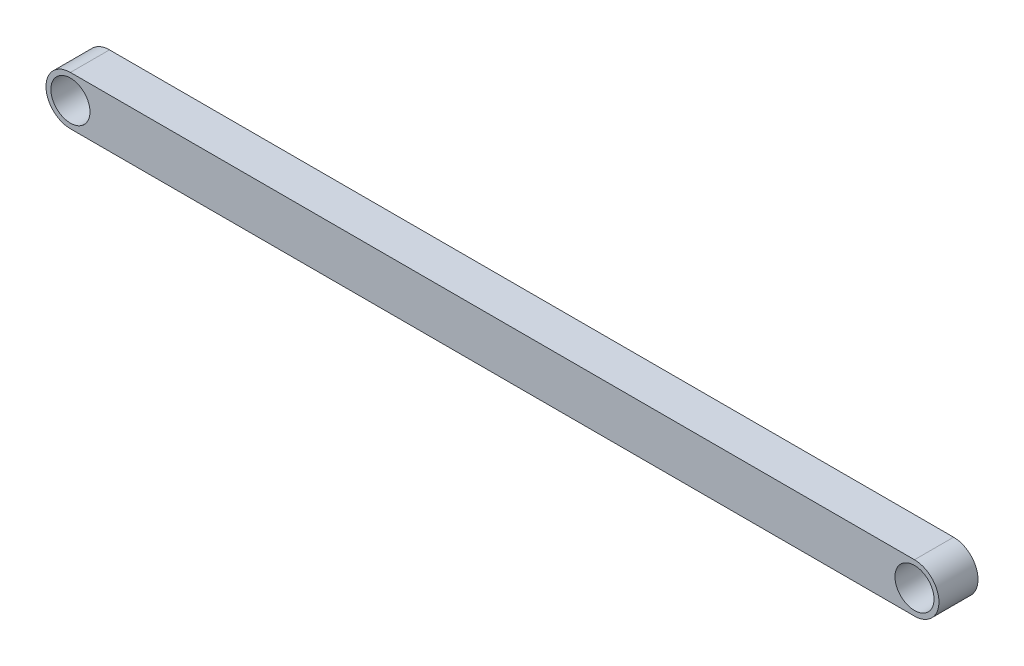
ISO-10303-21;
HEADER;
FILE_DESCRIPTION(('STEP AP214'),'2;1');
FILE_NAME('part.step','',(''),(''),'','','');
FILE_SCHEMA(('AUTOMOTIVE_DESIGN { 1 0 10303 214 1 1 1 1 }'));
ENDSEC;
DATA;
#1=APPLICATION_CONTEXT('core data for automotive mechanical design processes');
#2=APPLICATION_PROTOCOL_DEFINITION('international standard','automotive_design',2000,#1);
#3=PRODUCT_CONTEXT('',#1,'mechanical');
#4=PRODUCT('Part','Part','',(#3));
#5=PRODUCT_RELATED_PRODUCT_CATEGORY('part','',(#4));
#6=PRODUCT_DEFINITION_FORMATION('','',#4);
#7=PRODUCT_DEFINITION_CONTEXT('part definition',#1,'design');
#8=PRODUCT_DEFINITION('design','',#6,#7);
#9=PRODUCT_DEFINITION_SHAPE('','',#8);
#10=(LENGTH_UNIT() NAMED_UNIT(*) SI_UNIT(.MILLI.,.METRE.));
#11=(NAMED_UNIT(*) PLANE_ANGLE_UNIT() SI_UNIT($,.RADIAN.));
#12=(NAMED_UNIT(*) SI_UNIT($,.STERADIAN.) SOLID_ANGLE_UNIT());
#13=UNCERTAINTY_MEASURE_WITH_UNIT(LENGTH_MEASURE(1.E-05),#10,'distance_accuracy_value','');
#14=(GEOMETRIC_REPRESENTATION_CONTEXT(3) GLOBAL_UNCERTAINTY_ASSIGNED_CONTEXT((#13)) GLOBAL_UNIT_ASSIGNED_CONTEXT((#10,
#11,#12)) REPRESENTATION_CONTEXT('',''));
#15=CARTESIAN_POINT('',(0.,0.,0.));
#16=DIRECTION('',(0.,0.,1.));
#17=DIRECTION('',(1.,0.,0.));
#18=AXIS2_PLACEMENT_3D('',#15,#16,#17);
#19=CARTESIAN_POINT('',(0.,0.,2.));
#20=DIRECTION('',(0.,0.,1.));
#21=DIRECTION('',(1.,0.,0.));
#22=AXIS2_PLACEMENT_3D('',#19,#20,#21);
#23=PLANE('',#22);
#24=CARTESIAN_POINT('',(0.,0.,2.));
#25=DIRECTION('',(0.,0.,1.));
#26=DIRECTION('',(1.,0.,0.));
#27=AXIS2_PLACEMENT_3D('',#24,#25,#26);
#28=CIRCLE('',#27,1.);
#29=CARTESIAN_POINT('',(1.,0.,2.));
#30=VERTEX_POINT('',#29);
#31=EDGE_CURVE('E100',#30,#30,#28,.T.);
#32=ORIENTED_EDGE('',*,*,#31,.F.);
#33=EDGE_LOOP('',(#32));
#34=FACE_BOUND('',#33,.T.);
#35=CARTESIAN_POINT('',(0.,0.,2.));
#36=DIRECTION('',(0.,0.,1.));
#37=DIRECTION('',(1.,0.,0.));
#38=AXIS2_PLACEMENT_3D('',#35,#36,#37);
#39=CIRCLE('',#38,1.25);
#40=CARTESIAN_POINT('',(0.,1.25,2.));
#41=VERTEX_POINT('',#40);
#42=CARTESIAN_POINT('',(0.,-1.25,2.));
#43=VERTEX_POINT('',#42);
#44=EDGE_CURVE('E85',#41,#43,#39,.T.);
#45=ORIENTED_EDGE('',*,*,#44,.T.);
#46=DIRECTION('',(1.,0.,0.));
#47=VECTOR('',#46,1.);
#48=CARTESIAN_POINT('',(0.,-1.25,2.));
#49=LINE('',#48,#47);
#50=CARTESIAN_POINT('',(43.2,-1.25,2.));
#51=VERTEX_POINT('',#50);
#52=EDGE_CURVE('E80',#43,#51,#49,.T.);
#53=ORIENTED_EDGE('',*,*,#52,.T.);
#54=CARTESIAN_POINT('',(43.2,0.,2.));
#55=DIRECTION('',(0.,0.,1.));
#56=DIRECTION('',(1.,0.,0.));
#57=AXIS2_PLACEMENT_3D('',#54,#55,#56);
#58=CIRCLE('',#57,1.25);
#59=CARTESIAN_POINT('',(43.2,1.25,2.));
#60=VERTEX_POINT('',#59);
#61=EDGE_CURVE('E83',#51,#60,#58,.T.);
#62=ORIENTED_EDGE('',*,*,#61,.T.);
#63=DIRECTION('',(-1.,0.,0.));
#64=VECTOR('',#63,1.);
#65=CARTESIAN_POINT('',(0.,1.25,2.));
#66=LINE('',#65,#64);
#67=EDGE_CURVE('E50',#60,#41,#66,.T.);
#68=ORIENTED_EDGE('',*,*,#67,.T.);
#69=EDGE_LOOP('',(#45,#53,#62,#68));
#70=FACE_BOUND('',#69,.T.);
#71=CARTESIAN_POINT('',(43.2,0.,2.));
#72=DIRECTION('',(0.,0.,1.));
#73=DIRECTION('',(1.,0.,0.));
#74=AXIS2_PLACEMENT_3D('',#71,#72,#73);
#75=CIRCLE('',#74,0.999999999999998);
#76=CARTESIAN_POINT('',(44.2,0.,2.));
#77=VERTEX_POINT('',#76);
#78=EDGE_CURVE('E115',#77,#77,#75,.T.);
#79=ORIENTED_EDGE('',*,*,#78,.F.);
#80=EDGE_LOOP('',(#79));
#81=FACE_BOUND('',#80,.T.);
#82=ADVANCED_FACE('F33',(#34,#70,#81),#23,.T.);
#83=CARTESIAN_POINT('',(0.,0.,0.));
#84=DIRECTION('',(0.,0.,1.));
#85=DIRECTION('',(1.,0.,0.));
#86=AXIS2_PLACEMENT_3D('',#83,#84,#85);
#87=PLANE('',#86);
#88=CARTESIAN_POINT('',(0.,0.,0.));
#89=DIRECTION('',(0.,0.,1.));
#90=DIRECTION('',(1.,0.,0.));
#91=AXIS2_PLACEMENT_3D('',#88,#89,#90);
#92=CIRCLE('',#91,1.25);
#93=CARTESIAN_POINT('',(0.,1.25,0.));
#94=VERTEX_POINT('',#93);
#95=CARTESIAN_POINT('',(0.,-1.25,0.));
#96=VERTEX_POINT('',#95);
#97=EDGE_CURVE('E97',#94,#96,#92,.T.);
#98=ORIENTED_EDGE('',*,*,#97,.F.);
#99=DIRECTION('',(-1.,0.,0.));
#100=VECTOR('',#99,1.);
#101=CARTESIAN_POINT('',(0.,1.25,0.));
#102=LINE('',#101,#100);
#103=CARTESIAN_POINT('',(43.2,1.25,0.));
#104=VERTEX_POINT('',#103);
#105=EDGE_CURVE('E73',#104,#94,#102,.T.);
#106=ORIENTED_EDGE('',*,*,#105,.F.);
#107=CARTESIAN_POINT('',(43.2,0.,0.));
#108=DIRECTION('',(0.,0.,1.));
#109=DIRECTION('',(1.,0.,0.));
#110=AXIS2_PLACEMENT_3D('',#107,#108,#109);
#111=CIRCLE('',#110,1.25);
#112=CARTESIAN_POINT('',(43.2,-1.25,0.));
#113=VERTEX_POINT('',#112);
#114=EDGE_CURVE('E67',#113,#104,#111,.T.);
#115=ORIENTED_EDGE('',*,*,#114,.F.);
#116=DIRECTION('',(1.,0.,0.));
#117=VECTOR('',#116,1.);
#118=CARTESIAN_POINT('',(0.,-1.25,0.));
#119=LINE('',#118,#117);
#120=EDGE_CURVE('E89',#96,#113,#119,.T.);
#121=ORIENTED_EDGE('',*,*,#120,.F.);
#122=EDGE_LOOP('',(#98,#106,#115,#121));
#123=FACE_BOUND('',#122,.T.);
#124=CARTESIAN_POINT('',(0.,0.,0.));
#125=DIRECTION('',(0.,0.,1.));
#126=DIRECTION('',(1.,0.,0.));
#127=AXIS2_PLACEMENT_3D('',#124,#125,#126);
#128=CIRCLE('',#127,1.);
#129=CARTESIAN_POINT('',(1.,0.,0.));
#130=VERTEX_POINT('',#129);
#131=EDGE_CURVE('E112',#130,#130,#128,.T.);
#132=ORIENTED_EDGE('',*,*,#131,.T.);
#133=EDGE_LOOP('',(#132));
#134=FACE_BOUND('',#133,.T.);
#135=CARTESIAN_POINT('',(43.2,0.,0.));
#136=DIRECTION('',(0.,0.,1.));
#137=DIRECTION('',(1.,0.,0.));
#138=AXIS2_PLACEMENT_3D('',#135,#136,#137);
#139=CIRCLE('',#138,0.999999999999998);
#140=CARTESIAN_POINT('',(44.2,0.,0.));
#141=VERTEX_POINT('',#140);
#142=EDGE_CURVE('E118',#141,#141,#139,.T.);
#143=ORIENTED_EDGE('',*,*,#142,.T.);
#144=EDGE_LOOP('',(#143));
#145=FACE_BOUND('',#144,.T.);
#146=ADVANCED_FACE('F108',(#123,#134,#145),#87,.F.);
#147=CARTESIAN_POINT('',(0.,0.,2.));
#148=DIRECTION('',(0.,0.,-1.));
#149=DIRECTION('',(-1.,0.,0.));
#150=AXIS2_PLACEMENT_3D('',#147,#148,#149);
#151=CYLINDRICAL_SURFACE('',#150,1.25);
#152=ORIENTED_EDGE('',*,*,#97,.T.);
#153=DIRECTION('',(0.,0.,-1.));
#154=VECTOR('',#153,1.);
#155=CARTESIAN_POINT('',(0.,-1.25,2.));
#156=LINE('',#155,#154);
#157=EDGE_CURVE('E11',#43,#96,#156,.T.);
#158=ORIENTED_EDGE('',*,*,#157,.F.);
#159=ORIENTED_EDGE('',*,*,#44,.F.);
#160=DIRECTION('',(0.,0.,-1.));
#161=VECTOR('',#160,1.);
#162=CARTESIAN_POINT('',(0.,1.25,2.));
#163=LINE('',#162,#161);
#164=EDGE_CURVE('E93',#41,#94,#163,.T.);
#165=ORIENTED_EDGE('',*,*,#164,.T.);
#166=EDGE_LOOP('',(#152,#158,#159,#165));
#167=FACE_BOUND('',#166,.T.);
#168=ADVANCED_FACE('F35',(#167),#151,.T.);
#169=CARTESIAN_POINT('',(0.,-1.25,2.));
#170=DIRECTION('',(0.,1.,0.));
#171=DIRECTION('',(0.,0.,1.));
#172=AXIS2_PLACEMENT_3D('',#169,#170,#171);
#173=PLANE('',#172);
#174=ORIENTED_EDGE('',*,*,#120,.T.);
#175=DIRECTION('',(0.,0.,-1.));
#176=VECTOR('',#175,1.);
#177=CARTESIAN_POINT('',(43.2,-1.25,2.));
#178=LINE('',#177,#176);
#179=EDGE_CURVE('E42',#51,#113,#178,.T.);
#180=ORIENTED_EDGE('',*,*,#179,.F.);
#181=ORIENTED_EDGE('',*,*,#52,.F.);
#182=ORIENTED_EDGE('',*,*,#157,.T.);
#183=EDGE_LOOP('',(#174,#180,#181,#182));
#184=FACE_BOUND('',#183,.T.);
#185=ADVANCED_FACE('F88',(#184),#173,.F.);
#186=CARTESIAN_POINT('',(43.2,0.,2.));
#187=DIRECTION('',(0.,0.,-1.));
#188=DIRECTION('',(-1.,0.,0.));
#189=AXIS2_PLACEMENT_3D('',#186,#187,#188);
#190=CYLINDRICAL_SURFACE('',#189,1.25);
#191=ORIENTED_EDGE('',*,*,#114,.T.);
#192=DIRECTION('',(0.,0.,-1.));
#193=VECTOR('',#192,1.);
#194=CARTESIAN_POINT('',(43.2,1.25,2.));
#195=LINE('',#194,#193);
#196=EDGE_CURVE('E90',#60,#104,#195,.T.);
#197=ORIENTED_EDGE('',*,*,#196,.F.);
#198=ORIENTED_EDGE('',*,*,#61,.F.);
#199=ORIENTED_EDGE('',*,*,#179,.T.);
#200=EDGE_LOOP('',(#191,#197,#198,#199));
#201=FACE_BOUND('',#200,.T.);
#202=ADVANCED_FACE('F91',(#201),#190,.T.);
#203=CARTESIAN_POINT('',(0.,1.25,2.));
#204=DIRECTION('',(0.,-1.,0.));
#205=DIRECTION('',(0.,0.,-1.));
#206=AXIS2_PLACEMENT_3D('',#203,#204,#205);
#207=PLANE('',#206);
#208=ORIENTED_EDGE('',*,*,#105,.T.);
#209=ORIENTED_EDGE('',*,*,#164,.F.);
#210=ORIENTED_EDGE('',*,*,#67,.F.);
#211=ORIENTED_EDGE('',*,*,#196,.T.);
#212=EDGE_LOOP('',(#208,#209,#210,#211));
#213=FACE_BOUND('',#212,.T.);
#214=ADVANCED_FACE('F105',(#213),#207,.F.);
#215=CARTESIAN_POINT('',(0.,0.,2.));
#216=DIRECTION('',(0.,0.,-1.));
#217=DIRECTION('',(-1.,0.,0.));
#218=AXIS2_PLACEMENT_3D('',#215,#216,#217);
#219=CYLINDRICAL_SURFACE('',#218,1.);
#220=ORIENTED_EDGE('',*,*,#31,.T.);
#221=EDGE_LOOP('',(#220));
#222=FACE_BOUND('',#221,.T.);
#223=ORIENTED_EDGE('',*,*,#131,.F.);
#224=EDGE_LOOP('',(#223));
#225=FACE_BOUND('',#224,.T.);
#226=ADVANCED_FACE('F135',(#222,#225),#219,.F.);
#227=CARTESIAN_POINT('',(43.2,0.,2.));
#228=DIRECTION('',(0.,0.,-1.));
#229=DIRECTION('',(-1.,0.,0.));
#230=AXIS2_PLACEMENT_3D('',#227,#228,#229);
#231=CYLINDRICAL_SURFACE('',#230,0.999999999999998);
#232=ORIENTED_EDGE('',*,*,#78,.T.);
#233=EDGE_LOOP('',(#232));
#234=FACE_BOUND('',#233,.T.);
#235=ORIENTED_EDGE('',*,*,#142,.F.);
#236=EDGE_LOOP('',(#235));
#237=FACE_BOUND('',#236,.T.);
#238=ADVANCED_FACE('F124',(#234,#237),#231,.F.);
#239=CLOSED_SHELL('',(#82,#146,#168,#185,#202,#214,#226,#238));
#240=MANIFOLD_SOLID_BREP('B2',#239);
#241=ADVANCED_BREP_SHAPE_REPRESENTATION('',(#18,#240),#14);
#242=SHAPE_DEFINITION_REPRESENTATION(#9,#241);
ENDSEC;
END-ISO-10303-21;
